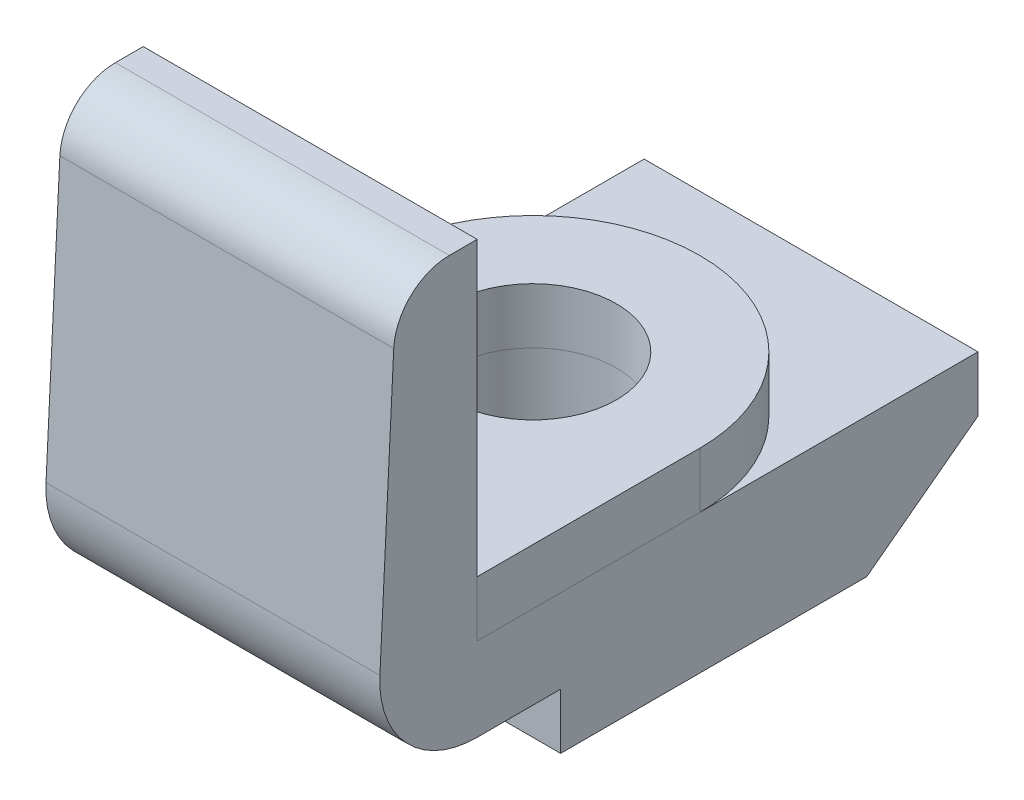
ISO-10303-21;
HEADER;
FILE_DESCRIPTION(('STEP AP214'),'2;1');
FILE_NAME('part.step','',(''),(''),'','','');
FILE_SCHEMA(('AUTOMOTIVE_DESIGN { 1 0 10303 214 1 1 1 1 }'));
ENDSEC;
DATA;
#1=APPLICATION_CONTEXT('core data for automotive mechanical design processes');
#2=APPLICATION_PROTOCOL_DEFINITION('international standard','automotive_design',2000,#1);
#3=PRODUCT_CONTEXT('',#1,'mechanical');
#4=PRODUCT('Part','Part','',(#3));
#5=PRODUCT_RELATED_PRODUCT_CATEGORY('part','',(#4));
#6=PRODUCT_DEFINITION_FORMATION('','',#4);
#7=PRODUCT_DEFINITION_CONTEXT('part definition',#1,'design');
#8=PRODUCT_DEFINITION('design','',#6,#7);
#9=PRODUCT_DEFINITION_SHAPE('','',#8);
#10=(LENGTH_UNIT() NAMED_UNIT(*) SI_UNIT(.MILLI.,.METRE.));
#11=(NAMED_UNIT(*) PLANE_ANGLE_UNIT() SI_UNIT($,.RADIAN.));
#12=(NAMED_UNIT(*) SI_UNIT($,.STERADIAN.) SOLID_ANGLE_UNIT());
#13=UNCERTAINTY_MEASURE_WITH_UNIT(LENGTH_MEASURE(1.E-05),#10,'distance_accuracy_value','');
#14=(GEOMETRIC_REPRESENTATION_CONTEXT(3) GLOBAL_UNCERTAINTY_ASSIGNED_CONTEXT((#13)) GLOBAL_UNIT_ASSIGNED_CONTEXT((#10,
#11,#12)) REPRESENTATION_CONTEXT('',''));
#15=CARTESIAN_POINT('',(0.,0.,0.));
#16=DIRECTION('',(0.,0.,1.));
#17=DIRECTION('',(1.,0.,0.));
#18=AXIS2_PLACEMENT_3D('',#15,#16,#17);
#19=CARTESIAN_POINT('',(38.1,12.7,-50.8));
#20=DIRECTION('',(0.,1.,0.));
#21=DIRECTION('',(0.,0.,1.));
#22=AXIS2_PLACEMENT_3D('',#19,#20,#21);
#23=PLANE('',#22);
#24=DIRECTION('',(1.,0.,0.));
#25=VECTOR('',#24,1.);
#26=CARTESIAN_POINT('',(76.2,12.7,0.));
#27=LINE('',#26,#25);
#28=CARTESIAN_POINT('',(0.,12.7,0.));
#29=VERTEX_POINT('',#28);
#30=CARTESIAN_POINT('',(76.2,12.7,0.));
#31=VERTEX_POINT('',#30);
#32=EDGE_CURVE('E101',#29,#31,#27,.T.);
#33=ORIENTED_EDGE('',*,*,#32,.T.);
#34=DIRECTION('',(0.,0.,-1.));
#35=VECTOR('',#34,1.);
#36=CARTESIAN_POINT('',(76.2,12.7,-50.8));
#37=LINE('',#36,#35);
#38=CARTESIAN_POINT('',(76.2,12.7,-50.8));
#39=VERTEX_POINT('',#38);
#40=EDGE_CURVE('E96',#31,#39,#37,.T.);
#41=ORIENTED_EDGE('',*,*,#40,.T.);
#42=CARTESIAN_POINT('',(38.1,12.7,-50.8));
#43=DIRECTION('',(0.,1.,0.));
#44=DIRECTION('',(0.,0.,1.));
#45=AXIS2_PLACEMENT_3D('',#42,#43,#44);
#46=CIRCLE('',#45,38.1);
#47=CARTESIAN_POINT('',(0.,12.7,-50.8));
#48=VERTEX_POINT('',#47);
#49=EDGE_CURVE('E99',#39,#48,#46,.T.);
#50=ORIENTED_EDGE('',*,*,#49,.T.);
#51=DIRECTION('',(0.,0.,1.));
#52=VECTOR('',#51,1.);
#53=CARTESIAN_POINT('',(0.,12.7,0.));
#54=LINE('',#53,#52);
#55=EDGE_CURVE('E66',#48,#29,#54,.T.);
#56=ORIENTED_EDGE('',*,*,#55,.T.);
#57=EDGE_LOOP('',(#33,#41,#50,#56));
#58=FACE_BOUND('',#57,.T.);
#59=CARTESIAN_POINT('',(38.1,12.7,-50.8));
#60=DIRECTION('',(0.,1.,0.));
#61=DIRECTION('',(0.,0.,1.));
#62=AXIS2_PLACEMENT_3D('',#59,#60,#61);
#63=CIRCLE('',#62,19.05);
#64=CARTESIAN_POINT('',(38.1,12.7,-31.75));
#65=VERTEX_POINT('',#64);
#66=EDGE_CURVE('E116',#65,#65,#63,.T.);
#67=ORIENTED_EDGE('',*,*,#66,.F.);
#68=EDGE_LOOP('',(#67));
#69=FACE_BOUND('',#68,.T.);
#70=ADVANCED_FACE('F49',(#58,#69),#23,.T.);
#71=CARTESIAN_POINT('',(38.1,0.,-50.8));
#72=DIRECTION('',(0.,1.,0.));
#73=DIRECTION('',(0.,0.,1.));
#74=AXIS2_PLACEMENT_3D('',#71,#72,#73);
#75=PLANE('',#74);
#76=DIRECTION('',(1.,0.,0.));
#77=VECTOR('',#76,1.);
#78=CARTESIAN_POINT('',(76.2,0.,0.));
#79=LINE('',#78,#77);
#80=CARTESIAN_POINT('',(0.,0.,0.));
#81=VERTEX_POINT('',#80);
#82=CARTESIAN_POINT('',(76.2,0.,0.));
#83=VERTEX_POINT('',#82);
#84=EDGE_CURVE('E113',#81,#83,#79,.T.);
#85=ORIENTED_EDGE('',*,*,#84,.F.);
#86=DIRECTION('',(0.,0.,1.));
#87=VECTOR('',#86,1.);
#88=CARTESIAN_POINT('',(0.,0.,0.));
#89=LINE('',#88,#87);
#90=CARTESIAN_POINT('',(0.,0.,-50.8));
#91=VERTEX_POINT('',#90);
#92=EDGE_CURVE('E89',#91,#81,#89,.T.);
#93=ORIENTED_EDGE('',*,*,#92,.F.);
#94=CARTESIAN_POINT('',(38.1,0.,-50.8));
#95=DIRECTION('',(0.,1.,0.));
#96=DIRECTION('',(0.,0.,1.));
#97=AXIS2_PLACEMENT_3D('',#94,#95,#96);
#98=CIRCLE('',#97,38.1);
#99=CARTESIAN_POINT('',(76.2,0.,-50.8));
#100=VERTEX_POINT('',#99);
#101=EDGE_CURVE('E83',#100,#91,#98,.T.);
#102=ORIENTED_EDGE('',*,*,#101,.F.);
#103=DIRECTION('',(0.,0.,-1.));
#104=VECTOR('',#103,1.);
#105=CARTESIAN_POINT('',(76.2,0.,-50.8));
#106=LINE('',#105,#104);
#107=EDGE_CURVE('E105',#83,#100,#106,.T.);
#108=ORIENTED_EDGE('',*,*,#107,.F.);
#109=EDGE_LOOP('',(#85,#93,#102,#108));
#110=FACE_BOUND('',#109,.T.);
#111=CARTESIAN_POINT('',(38.1,0.,-50.8));
#112=DIRECTION('',(0.,1.,0.));
#113=DIRECTION('',(0.,0.,1.));
#114=AXIS2_PLACEMENT_3D('',#111,#112,#113);
#115=CIRCLE('',#114,19.05);
#116=CARTESIAN_POINT('',(38.1,0.,-31.75));
#117=VERTEX_POINT('',#116);
#118=EDGE_CURVE('E128',#117,#117,#115,.T.);
#119=ORIENTED_EDGE('',*,*,#118,.T.);
#120=EDGE_LOOP('',(#119));
#121=FACE_BOUND('',#120,.T.);
#122=ADVANCED_FACE('F124',(#110,#121),#75,.F.);
#123=CARTESIAN_POINT('',(76.2,12.7,0.));
#124=DIRECTION('',(0.,0.,-1.));
#125=DIRECTION('',(0.,1.,0.));
#126=AXIS2_PLACEMENT_3D('',#123,#124,#125);
#127=PLANE('',#126);
#128=ORIENTED_EDGE('',*,*,#84,.T.);
#129=DIRECTION('',(0.,-1.,0.));
#130=VECTOR('',#129,1.);
#131=CARTESIAN_POINT('',(76.2,12.7,0.));
#132=LINE('',#131,#130);
#133=EDGE_CURVE('E13',#31,#83,#132,.T.);
#134=ORIENTED_EDGE('',*,*,#133,.F.);
#135=ORIENTED_EDGE('',*,*,#32,.F.);
#136=DIRECTION('',(0.,-1.,0.));
#137=VECTOR('',#136,1.);
#138=CARTESIAN_POINT('',(0.,12.7,0.));
#139=LINE('',#138,#137);
#140=EDGE_CURVE('E109',#29,#81,#139,.T.);
#141=ORIENTED_EDGE('',*,*,#140,.T.);
#142=EDGE_LOOP('',(#128,#134,#135,#141));
#143=FACE_BOUND('',#142,.T.);
#144=ADVANCED_FACE('F51',(#143),#127,.F.);
#145=CARTESIAN_POINT('',(76.2,12.7,-50.8));
#146=DIRECTION('',(-1.,0.,0.));
#147=DIRECTION('',(0.,0.,1.));
#148=AXIS2_PLACEMENT_3D('',#145,#146,#147);
#149=PLANE('',#148);
#150=ORIENTED_EDGE('',*,*,#107,.T.);
#151=DIRECTION('',(0.,-1.,0.));
#152=VECTOR('',#151,1.);
#153=CARTESIAN_POINT('',(76.2,12.7,-50.8));
#154=LINE('',#153,#152);
#155=EDGE_CURVE('E58',#39,#100,#154,.T.);
#156=ORIENTED_EDGE('',*,*,#155,.F.);
#157=ORIENTED_EDGE('',*,*,#40,.F.);
#158=ORIENTED_EDGE('',*,*,#133,.T.);
#159=EDGE_LOOP('',(#150,#156,#157,#158));
#160=FACE_BOUND('',#159,.T.);
#161=ADVANCED_FACE('F104',(#160),#149,.F.);
#162=CARTESIAN_POINT('',(38.1,12.7,-50.8));
#163=DIRECTION('',(0.,-1.,0.));
#164=DIRECTION('',(0.,0.,-1.));
#165=AXIS2_PLACEMENT_3D('',#162,#163,#164);
#166=CYLINDRICAL_SURFACE('',#165,38.1);
#167=ORIENTED_EDGE('',*,*,#101,.T.);
#168=DIRECTION('',(0.,-1.,0.));
#169=VECTOR('',#168,1.);
#170=CARTESIAN_POINT('',(0.,12.7,-50.8));
#171=LINE('',#170,#169);
#172=EDGE_CURVE('E106',#48,#91,#171,.T.);
#173=ORIENTED_EDGE('',*,*,#172,.F.);
#174=ORIENTED_EDGE('',*,*,#49,.F.);
#175=ORIENTED_EDGE('',*,*,#155,.T.);
#176=EDGE_LOOP('',(#167,#173,#174,#175));
#177=FACE_BOUND('',#176,.T.);
#178=ADVANCED_FACE('F107',(#177),#166,.T.);
#179=CARTESIAN_POINT('',(0.,12.7,0.));
#180=DIRECTION('',(1.,0.,0.));
#181=DIRECTION('',(0.,0.,-1.));
#182=AXIS2_PLACEMENT_3D('',#179,#180,#181);
#183=PLANE('',#182);
#184=ORIENTED_EDGE('',*,*,#92,.T.);
#185=ORIENTED_EDGE('',*,*,#140,.F.);
#186=ORIENTED_EDGE('',*,*,#55,.F.);
#187=ORIENTED_EDGE('',*,*,#172,.T.);
#188=EDGE_LOOP('',(#184,#185,#186,#187));
#189=FACE_BOUND('',#188,.T.);
#190=ADVANCED_FACE('F121',(#189),#183,.F.);
#191=CARTESIAN_POINT('',(38.1,12.7,-50.8));
#192=DIRECTION('',(0.,-1.,0.));
#193=DIRECTION('',(0.,0.,-1.));
#194=AXIS2_PLACEMENT_3D('',#191,#192,#193);
#195=CYLINDRICAL_SURFACE('',#194,19.05);
#196=ORIENTED_EDGE('',*,*,#66,.T.);
#197=EDGE_LOOP('',(#196));
#198=FACE_BOUND('',#197,.T.);
#199=ORIENTED_EDGE('',*,*,#118,.F.);
#200=EDGE_LOOP('',(#199));
#201=FACE_BOUND('',#200,.T.);
#202=ADVANCED_FACE('F134',(#198,#201),#195,.F.);
#203=CLOSED_SHELL('',(#70,#122,#144,#161,#178,#190,#202));
#204=MANIFOLD_SOLID_BREP('B2',#203);
#205=CARTESIAN_POINT('',(76.1999999999999,0.,0.));
#206=DIRECTION('',(1.,0.,0.));
#207=DIRECTION('',(0.,0.,-1.));
#208=AXIS2_PLACEMENT_3D('',#205,#206,#207);
#209=PLANE('',#208);
#210=DIRECTION('',(0.,0.,-1.));
#211=VECTOR('',#210,1.);
#212=CARTESIAN_POINT('',(76.2,0.,0.));
#213=LINE('',#212,#211);
#214=CARTESIAN_POINT('',(76.2,0.,0.));
#215=VERTEX_POINT('',#214);
#216=CARTESIAN_POINT('',(76.2,0.,-114.3));
#217=VERTEX_POINT('',#216);
#218=EDGE_CURVE('E202',#215,#217,#213,.T.);
#219=ORIENTED_EDGE('',*,*,#218,.F.);
#220=DIRECTION('',(0.,1.,0.));
#221=VECTOR('',#220,1.);
#222=CARTESIAN_POINT('',(76.2,0.,0.));
#223=LINE('',#222,#221);
#224=CARTESIAN_POINT('',(76.2,79.375,0.));
#225=VERTEX_POINT('',#224);
#226=EDGE_CURVE('E282',#215,#225,#223,.T.);
#227=ORIENTED_EDGE('',*,*,#226,.T.);
#228=DIRECTION('',(0.,0.,1.));
#229=VECTOR('',#228,1.);
#230=CARTESIAN_POINT('',(76.2,79.375,0.));
#231=LINE('',#230,#229);
#232=CARTESIAN_POINT('',(76.2,79.375,6.35));
#233=VERTEX_POINT('',#232);
#234=EDGE_CURVE('E418',#225,#233,#231,.T.);
#235=ORIENTED_EDGE('',*,*,#234,.T.);
#236=CARTESIAN_POINT('',(76.1999999999999,66.675,6.35));
#237=DIRECTION('',(-1.,0.,0.));
#238=DIRECTION('',(0.,0.,1.));
#239=AXIS2_PLACEMENT_3D('',#236,#237,#238);
#240=CIRCLE('',#239,12.7);
#241=CARTESIAN_POINT('',(76.1999999999999,67.3115964959789,19.0340350402113));
#242=VERTEX_POINT('',#241);
#243=EDGE_CURVE('E402',#242,#233,#240,.T.);
#244=ORIENTED_EDGE('',*,*,#243,.F.);
#245=DIRECTION('',(0.,-0.998742916552069,0.050125708344793));
#246=VECTOR('',#245,1.);
#247=CARTESIAN_POINT('',(76.1999999999999,67.3115964959789,19.0340350402113));
#248=LINE('',#247,#246);
#249=CARTESIAN_POINT('',(76.1999999999999,4.28904386796301,22.1970613203697));
#250=VERTEX_POINT('',#249);
#251=EDGE_CURVE('E392',#242,#250,#248,.T.);
#252=ORIENTED_EDGE('',*,*,#251,.T.);
#253=CARTESIAN_POINT('',(76.2,3.17499999999999,0.));
#254=DIRECTION('',(1.,0.,0.));
#255=DIRECTION('',(0.,0.,-1.));
#256=AXIS2_PLACEMENT_3D('',#253,#254,#255);
#257=CIRCLE('',#256,22.225);
#258=CARTESIAN_POINT('',(76.2,-19.05,0.));
#259=VERTEX_POINT('',#258);
#260=EDGE_CURVE('E378',#250,#259,#257,.T.);
#261=ORIENTED_EDGE('',*,*,#260,.T.);
#262=DIRECTION('',(0.,0.,-1.));
#263=VECTOR('',#262,1.);
#264=CARTESIAN_POINT('',(76.2,-19.05,0.));
#265=LINE('',#264,#263);
#266=CARTESIAN_POINT('',(76.2,-19.05,-19.05));
#267=VERTEX_POINT('',#266);
#268=EDGE_CURVE('E364',#259,#267,#265,.T.);
#269=ORIENTED_EDGE('',*,*,#268,.T.);
#270=DIRECTION('',(0.,-1.,0.));
#271=VECTOR('',#270,1.);
#272=CARTESIAN_POINT('',(76.2,-19.05,-19.05));
#273=LINE('',#272,#271);
#274=CARTESIAN_POINT('',(76.2,-31.75,-19.05));
#275=VERTEX_POINT('',#274);
#276=EDGE_CURVE('E350',#267,#275,#273,.T.);
#277=ORIENTED_EDGE('',*,*,#276,.T.);
#278=DIRECTION('',(0.,0.,-1.));
#279=VECTOR('',#278,1.);
#280=CARTESIAN_POINT('',(76.2,-31.75,-19.05));
#281=LINE('',#280,#279);
#282=CARTESIAN_POINT('',(76.2,-31.75,-88.9));
#283=VERTEX_POINT('',#282);
#284=EDGE_CURVE('E336',#275,#283,#281,.T.);
#285=ORIENTED_EDGE('',*,*,#284,.T.);
#286=DIRECTION('',(0.,0.6,-0.8));
#287=VECTOR('',#286,1.);
#288=CARTESIAN_POINT('',(76.2,-31.75,-88.9));
#289=LINE('',#288,#287);
#290=CARTESIAN_POINT('',(76.2,-12.7,-114.3));
#291=VERTEX_POINT('',#290);
#292=EDGE_CURVE('E322',#283,#291,#289,.T.);
#293=ORIENTED_EDGE('',*,*,#292,.T.);
#294=DIRECTION('',(0.,1.,0.));
#295=VECTOR('',#294,1.);
#296=CARTESIAN_POINT('',(76.2,-12.7,-114.3));
#297=LINE('',#296,#295);
#298=EDGE_CURVE('E300',#291,#217,#297,.T.);
#299=ORIENTED_EDGE('',*,*,#298,.T.);
#300=EDGE_LOOP('',(#219,#227,#235,#244,#252,#261,#269,#277,#285,#293,#299));
#301=FACE_BOUND('',#300,.T.);
#302=ADVANCED_FACE('F193',(#301),#209,.T.);
#303=CARTESIAN_POINT('',(0.,0.,0.));
#304=DIRECTION('',(1.,0.,0.));
#305=DIRECTION('',(0.,0.,-1.));
#306=AXIS2_PLACEMENT_3D('',#303,#304,#305);
#307=PLANE('',#306);
#308=DIRECTION('',(0.,0.,-1.));
#309=VECTOR('',#308,1.);
#310=CARTESIAN_POINT('',(0.,0.,0.));
#311=LINE('',#310,#309);
#312=CARTESIAN_POINT('',(0.,0.,0.));
#313=VERTEX_POINT('',#312);
#314=CARTESIAN_POINT('',(0.,0.,-114.3));
#315=VERTEX_POINT('',#314);
#316=EDGE_CURVE('E47',#313,#315,#311,.T.);
#317=ORIENTED_EDGE('',*,*,#316,.T.);
#318=DIRECTION('',(0.,1.,0.));
#319=VECTOR('',#318,1.);
#320=CARTESIAN_POINT('',(0.,-12.7,-114.3));
#321=LINE('',#320,#319);
#322=CARTESIAN_POINT('',(0.,-12.7,-114.3));
#323=VERTEX_POINT('',#322);
#324=EDGE_CURVE('E293',#323,#315,#321,.T.);
#325=ORIENTED_EDGE('',*,*,#324,.F.);
#326=DIRECTION('',(0.,0.6,-0.8));
#327=VECTOR('',#326,1.);
#328=CARTESIAN_POINT('',(0.,-31.75,-88.9));
#329=LINE('',#328,#327);
#330=CARTESIAN_POINT('',(0.,-31.75,-88.9));
#331=VERTEX_POINT('',#330);
#332=EDGE_CURVE('E318',#331,#323,#329,.T.);
#333=ORIENTED_EDGE('',*,*,#332,.F.);
#334=DIRECTION('',(0.,0.,-1.));
#335=VECTOR('',#334,1.);
#336=CARTESIAN_POINT('',(0.,-31.75,-19.05));
#337=LINE('',#336,#335);
#338=CARTESIAN_POINT('',(0.,-31.75,-19.05));
#339=VERTEX_POINT('',#338);
#340=EDGE_CURVE('E331',#339,#331,#337,.T.);
#341=ORIENTED_EDGE('',*,*,#340,.F.);
#342=DIRECTION('',(0.,-1.,0.));
#343=VECTOR('',#342,1.);
#344=CARTESIAN_POINT('',(0.,-19.05,-19.05));
#345=LINE('',#344,#343);
#346=CARTESIAN_POINT('',(0.,-19.05,-19.05));
#347=VERTEX_POINT('',#346);
#348=EDGE_CURVE('E345',#347,#339,#345,.T.);
#349=ORIENTED_EDGE('',*,*,#348,.F.);
#350=DIRECTION('',(0.,0.,-1.));
#351=VECTOR('',#350,1.);
#352=CARTESIAN_POINT('',(0.,-19.05,0.));
#353=LINE('',#352,#351);
#354=CARTESIAN_POINT('',(0.,-19.05,0.));
#355=VERTEX_POINT('',#354);
#356=EDGE_CURVE('E359',#355,#347,#353,.T.);
#357=ORIENTED_EDGE('',*,*,#356,.F.);
#358=CARTESIAN_POINT('',(0.,3.17499999999999,0.));
#359=DIRECTION('',(1.,0.,0.));
#360=DIRECTION('',(0.,0.,-1.));
#361=AXIS2_PLACEMENT_3D('',#358,#359,#360);
#362=CIRCLE('',#361,22.225);
#363=CARTESIAN_POINT('',(0.,4.28904386796301,22.1970613203697));
#364=VERTEX_POINT('',#363);
#365=EDGE_CURVE('E373',#364,#355,#362,.T.);
#366=ORIENTED_EDGE('',*,*,#365,.F.);
#367=DIRECTION('',(0.,-0.998742916552069,0.050125708344793));
#368=VECTOR('',#367,1.);
#369=CARTESIAN_POINT('',(0.,67.3115964959789,19.0340350402113));
#370=LINE('',#369,#368);
#371=CARTESIAN_POINT('',(0.,67.3115964959789,19.0340350402113));
#372=VERTEX_POINT('',#371);
#373=EDGE_CURVE('E387',#372,#364,#370,.T.);
#374=ORIENTED_EDGE('',*,*,#373,.F.);
#375=CARTESIAN_POINT('',(0.,66.675,6.35));
#376=DIRECTION('',(-1.,0.,0.));
#377=DIRECTION('',(0.,0.,1.));
#378=AXIS2_PLACEMENT_3D('',#375,#376,#377);
#379=CIRCLE('',#378,12.7);
#380=CARTESIAN_POINT('',(0.,79.375,6.35));
#381=VERTEX_POINT('',#380);
#382=EDGE_CURVE('E396',#372,#381,#379,.T.);
#383=ORIENTED_EDGE('',*,*,#382,.T.);
#384=DIRECTION('',(0.,0.,1.));
#385=VECTOR('',#384,1.);
#386=CARTESIAN_POINT('',(0.,79.375,0.));
#387=LINE('',#386,#385);
#388=CARTESIAN_POINT('',(0.,79.375,0.));
#389=VERTEX_POINT('',#388);
#390=EDGE_CURVE('E272',#389,#381,#387,.T.);
#391=ORIENTED_EDGE('',*,*,#390,.F.);
#392=DIRECTION('',(0.,1.,0.));
#393=VECTOR('',#392,1.);
#394=CARTESIAN_POINT('',(0.,0.,0.));
#395=LINE('',#394,#393);
#396=EDGE_CURVE('E268',#313,#389,#395,.T.);
#397=ORIENTED_EDGE('',*,*,#396,.F.);
#398=EDGE_LOOP('',(#317,#325,#333,#341,#349,#357,#366,#374,#383,#391,#397));
#399=FACE_BOUND('',#398,.T.);
#400=ADVANCED_FACE('F270',(#399),#307,.F.);
#401=CARTESIAN_POINT('',(0.,0.,0.));
#402=DIRECTION('',(0.,0.,-1.));
#403=DIRECTION('',(-1.,0.,0.));
#404=AXIS2_PLACEMENT_3D('',#401,#402,#403);
#405=PLANE('',#404);
#406=ORIENTED_EDGE('',*,*,#226,.F.);
#407=DIRECTION('',(1.,0.,0.));
#408=VECTOR('',#407,1.);
#409=CARTESIAN_POINT('',(0.,0.,0.));
#410=LINE('',#409,#408);
#411=EDGE_CURVE('E277',#313,#215,#410,.T.);
#412=ORIENTED_EDGE('',*,*,#411,.F.);
#413=ORIENTED_EDGE('',*,*,#396,.T.);
#414=DIRECTION('',(1.,0.,0.));
#415=VECTOR('',#414,1.);
#416=CARTESIAN_POINT('',(0.,79.375,0.));
#417=LINE('',#416,#415);
#418=EDGE_CURVE('E276',#389,#225,#417,.T.);
#419=ORIENTED_EDGE('',*,*,#418,.T.);
#420=EDGE_LOOP('',(#406,#412,#413,#419));
#421=FACE_BOUND('',#420,.T.);
#422=ADVANCED_FACE('F281',(#421),#405,.T.);
#423=CARTESIAN_POINT('',(0.,79.375,0.));
#424=DIRECTION('',(0.,1.,0.));
#425=DIRECTION('',(0.,0.,1.));
#426=AXIS2_PLACEMENT_3D('',#423,#424,#425);
#427=PLANE('',#426);
#428=ORIENTED_EDGE('',*,*,#234,.F.);
#429=ORIENTED_EDGE('',*,*,#418,.F.);
#430=ORIENTED_EDGE('',*,*,#390,.T.);
#431=DIRECTION('',(1.,0.,0.));
#432=VECTOR('',#431,1.);
#433=CARTESIAN_POINT('',(0.,79.375,6.35));
#434=LINE('',#433,#432);
#435=EDGE_CURVE('E410',#381,#233,#434,.T.);
#436=ORIENTED_EDGE('',*,*,#435,.T.);
#437=EDGE_LOOP('',(#428,#429,#430,#436));
#438=FACE_BOUND('',#437,.T.);
#439=ADVANCED_FACE('F425',(#438),#427,.T.);
#440=CARTESIAN_POINT('',(0.,67.3115964959789,19.0340350402113));
#441=DIRECTION('',(0.,0.050125708344793,0.998742916552069));
#442=DIRECTION('',(0.,-0.998742916552069,0.050125708344793));
#443=AXIS2_PLACEMENT_3D('',#440,#441,#442);
#444=PLANE('',#443);
#445=ORIENTED_EDGE('',*,*,#251,.F.);
#446=DIRECTION('',(1.,0.,0.));
#447=VECTOR('',#446,1.);
#448=CARTESIAN_POINT('',(0.,67.3115964959789,19.0340350402113));
#449=LINE('',#448,#447);
#450=EDGE_CURVE('E399',#372,#242,#449,.T.);
#451=ORIENTED_EDGE('',*,*,#450,.F.);
#452=ORIENTED_EDGE('',*,*,#373,.T.);
#453=DIRECTION('',(1.,0.,0.));
#454=VECTOR('',#453,1.);
#455=CARTESIAN_POINT('',(0.,4.28904386796301,22.1970613203697));
#456=LINE('',#455,#454);
#457=EDGE_CURVE('E382',#364,#250,#456,.T.);
#458=ORIENTED_EDGE('',*,*,#457,.T.);
#459=EDGE_LOOP('',(#445,#451,#452,#458));
#460=FACE_BOUND('',#459,.T.);
#461=ADVANCED_FACE('F451',(#460),#444,.T.);
#462=CARTESIAN_POINT('',(0.,3.17499999999999,0.));
#463=DIRECTION('',(1.,0.,0.));
#464=DIRECTION('',(0.,0.,-1.));
#465=AXIS2_PLACEMENT_3D('',#462,#463,#464);
#466=CYLINDRICAL_SURFACE('',#465,22.225);
#467=ORIENTED_EDGE('',*,*,#260,.F.);
#468=ORIENTED_EDGE('',*,*,#457,.F.);
#469=ORIENTED_EDGE('',*,*,#365,.T.);
#470=DIRECTION('',(1.,0.,0.));
#471=VECTOR('',#470,1.);
#472=CARTESIAN_POINT('',(0.,-19.05,0.));
#473=LINE('',#472,#471);
#474=EDGE_CURVE('E368',#355,#259,#473,.T.);
#475=ORIENTED_EDGE('',*,*,#474,.T.);
#476=EDGE_LOOP('',(#467,#468,#469,#475));
#477=FACE_BOUND('',#476,.T.);
#478=ADVANCED_FACE('F448',(#477),#466,.T.);
#479=CARTESIAN_POINT('',(0.,-19.05,0.));
#480=DIRECTION('',(0.,-1.,0.));
#481=DIRECTION('',(0.,0.,-1.));
#482=AXIS2_PLACEMENT_3D('',#479,#480,#481);
#483=PLANE('',#482);
#484=ORIENTED_EDGE('',*,*,#268,.F.);
#485=ORIENTED_EDGE('',*,*,#474,.F.);
#486=ORIENTED_EDGE('',*,*,#356,.T.);
#487=DIRECTION('',(1.,0.,0.));
#488=VECTOR('',#487,1.);
#489=CARTESIAN_POINT('',(0.,-19.05,-19.05));
#490=LINE('',#489,#488);
#491=EDGE_CURVE('E354',#347,#267,#490,.T.);
#492=ORIENTED_EDGE('',*,*,#491,.T.);
#493=EDGE_LOOP('',(#484,#485,#486,#492));
#494=FACE_BOUND('',#493,.T.);
#495=ADVANCED_FACE('F443',(#494),#483,.T.);
#496=CARTESIAN_POINT('',(0.,-19.05,-19.05));
#497=DIRECTION('',(0.,0.,1.));
#498=DIRECTION('',(0.,-1.,0.));
#499=AXIS2_PLACEMENT_3D('',#496,#497,#498);
#500=PLANE('',#499);
#501=ORIENTED_EDGE('',*,*,#276,.F.);
#502=ORIENTED_EDGE('',*,*,#491,.F.);
#503=ORIENTED_EDGE('',*,*,#348,.T.);
#504=DIRECTION('',(1.,0.,0.));
#505=VECTOR('',#504,1.);
#506=CARTESIAN_POINT('',(0.,-31.75,-19.05));
#507=LINE('',#506,#505);
#508=EDGE_CURVE('E340',#339,#275,#507,.T.);
#509=ORIENTED_EDGE('',*,*,#508,.T.);
#510=EDGE_LOOP('',(#501,#502,#503,#509));
#511=FACE_BOUND('',#510,.T.);
#512=ADVANCED_FACE('F439',(#511),#500,.T.);
#513=CARTESIAN_POINT('',(0.,-31.75,-19.05));
#514=DIRECTION('',(0.,-1.,0.));
#515=DIRECTION('',(0.,0.,-1.));
#516=AXIS2_PLACEMENT_3D('',#513,#514,#515);
#517=PLANE('',#516);
#518=CARTESIAN_POINT('',(38.1,-31.75,-50.8));
#519=DIRECTION('',(0.,-1.,0.));
#520=DIRECTION('',(0.,0.,-1.));
#521=AXIS2_PLACEMENT_3D('',#518,#519,#520);
#522=CIRCLE('',#521,19.05);
#523=CARTESIAN_POINT('',(38.1,-31.75,-69.85));
#524=VERTEX_POINT('',#523);
#525=EDGE_CURVE('E312',#524,#524,#522,.T.);
#526=ORIENTED_EDGE('',*,*,#525,.F.);
#527=EDGE_LOOP('',(#526));
#528=FACE_BOUND('',#527,.T.);
#529=ORIENTED_EDGE('',*,*,#284,.F.);
#530=ORIENTED_EDGE('',*,*,#508,.F.);
#531=ORIENTED_EDGE('',*,*,#340,.T.);
#532=DIRECTION('',(1.,0.,0.));
#533=VECTOR('',#532,1.);
#534=CARTESIAN_POINT('',(0.,-31.75,-88.9));
#535=LINE('',#534,#533);
#536=EDGE_CURVE('E326',#331,#283,#535,.T.);
#537=ORIENTED_EDGE('',*,*,#536,.T.);
#538=EDGE_LOOP('',(#529,#530,#531,#537));
#539=FACE_BOUND('',#538,.T.);
#540=ADVANCED_FACE('F436',(#528,#539),#517,.T.);
#541=CARTESIAN_POINT('',(0.,-31.75,-88.9));
#542=DIRECTION('',(0.,-0.8,-0.6));
#543=DIRECTION('',(0.,0.6,-0.8));
#544=AXIS2_PLACEMENT_3D('',#541,#542,#543);
#545=PLANE('',#544);
#546=ORIENTED_EDGE('',*,*,#292,.F.);
#547=ORIENTED_EDGE('',*,*,#536,.F.);
#548=ORIENTED_EDGE('',*,*,#332,.T.);
#549=DIRECTION('',(1.,0.,0.));
#550=VECTOR('',#549,1.);
#551=CARTESIAN_POINT('',(0.,-12.7,-114.3));
#552=LINE('',#551,#550);
#553=EDGE_CURVE('E298',#323,#291,#552,.T.);
#554=ORIENTED_EDGE('',*,*,#553,.T.);
#555=EDGE_LOOP('',(#546,#547,#548,#554));
#556=FACE_BOUND('',#555,.T.);
#557=ADVANCED_FACE('F432',(#556),#545,.T.);
#558=CARTESIAN_POINT('',(0.,-12.7,-114.3));
#559=DIRECTION('',(0.,0.,-1.));
#560=DIRECTION('',(-1.,0.,0.));
#561=AXIS2_PLACEMENT_3D('',#558,#559,#560);
#562=PLANE('',#561);
#563=ORIENTED_EDGE('',*,*,#298,.F.);
#564=ORIENTED_EDGE('',*,*,#553,.F.);
#565=ORIENTED_EDGE('',*,*,#324,.T.);
#566=DIRECTION('',(1.,0.,0.));
#567=VECTOR('',#566,1.);
#568=CARTESIAN_POINT('',(0.,0.,-114.3));
#569=LINE('',#568,#567);
#570=EDGE_CURVE('E288',#315,#217,#569,.T.);
#571=ORIENTED_EDGE('',*,*,#570,.T.);
#572=EDGE_LOOP('',(#563,#564,#565,#571));
#573=FACE_BOUND('',#572,.T.);
#574=ADVANCED_FACE('F296',(#573),#562,.T.);
#575=CARTESIAN_POINT('',(0.,0.,0.));
#576=DIRECTION('',(0.,-1.,0.));
#577=DIRECTION('',(0.,0.,-1.));
#578=AXIS2_PLACEMENT_3D('',#575,#576,#577);
#579=PLANE('',#578);
#580=CARTESIAN_POINT('',(38.1,0.,-50.8));
#581=DIRECTION('',(0.,1.,0.));
#582=DIRECTION('',(0.,0.,1.));
#583=AXIS2_PLACEMENT_3D('',#580,#581,#582);
#584=CIRCLE('',#583,19.05);
#585=CARTESIAN_POINT('',(38.1,0.,-31.75));
#586=VERTEX_POINT('',#585);
#587=EDGE_CURVE('E574',#586,#586,#584,.T.);
#588=ORIENTED_EDGE('',*,*,#587,.F.);
#589=EDGE_LOOP('',(#588));
#590=FACE_BOUND('',#589,.T.);
#591=ORIENTED_EDGE('',*,*,#218,.T.);
#592=ORIENTED_EDGE('',*,*,#570,.F.);
#593=ORIENTED_EDGE('',*,*,#316,.F.);
#594=ORIENTED_EDGE('',*,*,#411,.T.);
#595=EDGE_LOOP('',(#591,#592,#593,#594));
#596=FACE_BOUND('',#595,.T.);
#597=ADVANCED_FACE('F286',(#590,#596),#579,.F.);
#598=CARTESIAN_POINT('',(0.,66.675,6.35));
#599=DIRECTION('',(1.,0.,0.));
#600=DIRECTION('',(0.,0.,-1.));
#601=AXIS2_PLACEMENT_3D('',#598,#599,#600);
#602=CYLINDRICAL_SURFACE('',#601,12.7);
#603=ORIENTED_EDGE('',*,*,#243,.T.);
#604=ORIENTED_EDGE('',*,*,#435,.F.);
#605=ORIENTED_EDGE('',*,*,#382,.F.);
#606=ORIENTED_EDGE('',*,*,#450,.T.);
#607=EDGE_LOOP('',(#603,#604,#605,#606));
#608=FACE_BOUND('',#607,.T.);
#609=ADVANCED_FACE('F454',(#608),#602,.T.);
#610=CARTESIAN_POINT('',(38.1,-48.514,-50.8));
#611=DIRECTION('',(0.,1.,0.));
#612=DIRECTION('',(0.,0.,1.));
#613=AXIS2_PLACEMENT_3D('',#610,#611,#612);
#614=CYLINDRICAL_SURFACE('',#613,19.05);
#615=ORIENTED_EDGE('',*,*,#525,.T.);
#616=EDGE_LOOP('',(#615));
#617=FACE_BOUND('',#616,.T.);
#618=ORIENTED_EDGE('',*,*,#587,.T.);
#619=EDGE_LOOP('',(#618));
#620=FACE_BOUND('',#619,.T.);
#621=ADVANCED_FACE('F456',(#617,#620),#614,.F.);
#622=CLOSED_SHELL('',(#302,#400,#422,#439,#461,#478,#495,#512,#540,#557,#574,#597,#609,#621));
#623=MANIFOLD_SOLID_BREP('B7',#622);
#624=ADVANCED_BREP_SHAPE_REPRESENTATION('',(#18,#204,#623),#14);
#625=SHAPE_DEFINITION_REPRESENTATION(#9,#624);
ENDSEC;
END-ISO-10303-21;
